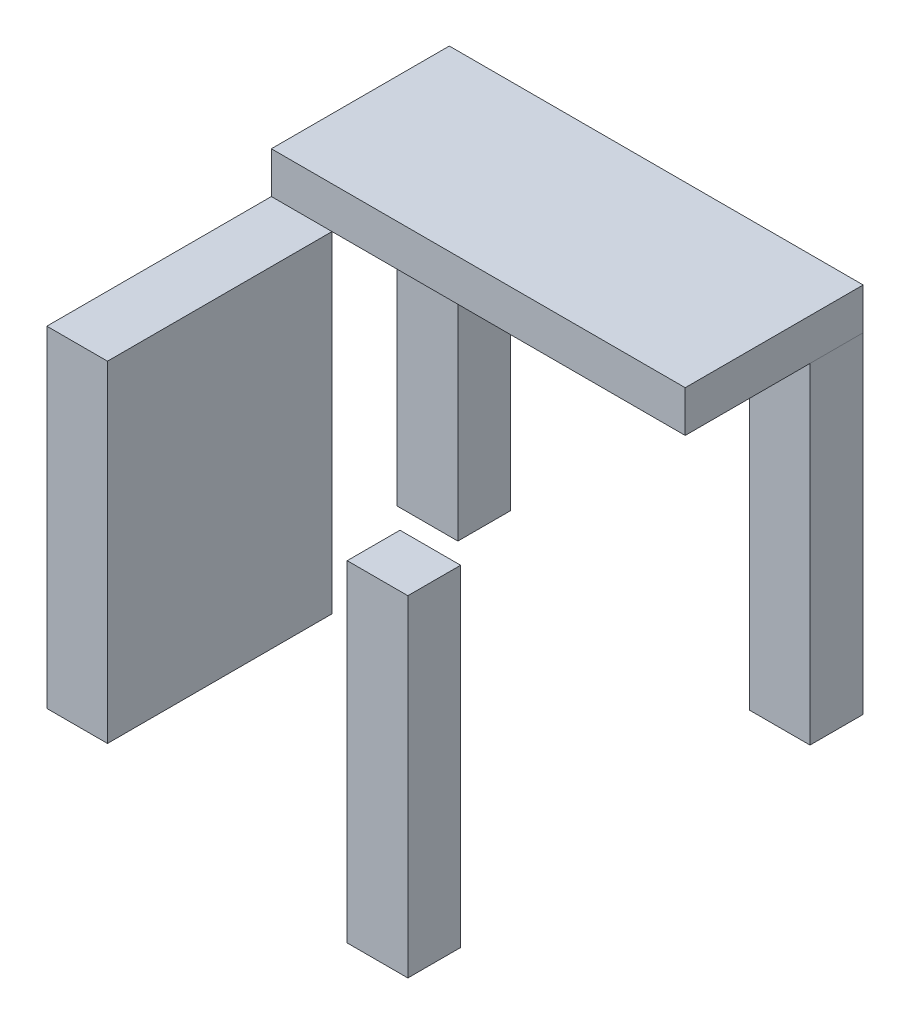
ISO-10303-21;
HEADER;
FILE_DESCRIPTION(('STEP AP214'),'2;1');
FILE_NAME('part.step','',(''),(''),'','','');
FILE_SCHEMA(('AUTOMOTIVE_DESIGN { 1 0 10303 214 1 1 1 1 }'));
ENDSEC;
DATA;
#1=APPLICATION_CONTEXT('core data for automotive mechanical design processes');
#2=APPLICATION_PROTOCOL_DEFINITION('international standard','automotive_design',2000,#1);
#3=PRODUCT_CONTEXT('',#1,'mechanical');
#4=PRODUCT('Part','Part','',(#3));
#5=PRODUCT_RELATED_PRODUCT_CATEGORY('part','',(#4));
#6=PRODUCT_DEFINITION_FORMATION('','',#4);
#7=PRODUCT_DEFINITION_CONTEXT('part definition',#1,'design');
#8=PRODUCT_DEFINITION('design','',#6,#7);
#9=PRODUCT_DEFINITION_SHAPE('','',#8);
#10=(LENGTH_UNIT() NAMED_UNIT(*) SI_UNIT(.MILLI.,.METRE.));
#11=(NAMED_UNIT(*) PLANE_ANGLE_UNIT() SI_UNIT($,.RADIAN.));
#12=(NAMED_UNIT(*) SI_UNIT($,.STERADIAN.) SOLID_ANGLE_UNIT());
#13=UNCERTAINTY_MEASURE_WITH_UNIT(LENGTH_MEASURE(1.E-05),#10,'distance_accuracy_value','');
#14=(GEOMETRIC_REPRESENTATION_CONTEXT(3) GLOBAL_UNCERTAINTY_ASSIGNED_CONTEXT((#13)) GLOBAL_UNIT_ASSIGNED_CONTEXT((#10,
#11,#12)) REPRESENTATION_CONTEXT('',''));
#15=CARTESIAN_POINT('',(0.,0.,0.));
#16=DIRECTION('',(0.,0.,1.));
#17=DIRECTION('',(1.,0.,0.));
#18=AXIS2_PLACEMENT_3D('',#15,#16,#17);
#19=CARTESIAN_POINT('',(85.36181093433,-80.,110.034688240795));
#20=DIRECTION('',(1.,0.,0.));
#21=DIRECTION('',(0.,0.,-1.));
#22=AXIS2_PLACEMENT_3D('',#19,#20,#21);
#23=PLANE('',#22);
#24=DIRECTION('',(0.,0.,-1.));
#25=VECTOR('',#24,1.);
#26=CARTESIAN_POINT('',(85.36181093433,0.,110.034688240795));
#27=LINE('',#26,#25);
#28=CARTESIAN_POINT('',(85.36181093433,0.,110.034688240795));
#29=VERTEX_POINT('',#28);
#30=CARTESIAN_POINT('',(85.36181093433,0.,97.2842820171065));
#31=VERTEX_POINT('',#30);
#32=EDGE_CURVE('E107',#29,#31,#27,.T.);
#33=ORIENTED_EDGE('',*,*,#32,.T.);
#34=DIRECTION('',(0.,1.,0.));
#35=VECTOR('',#34,1.);
#36=CARTESIAN_POINT('',(85.36181093433,-80.,97.2842820171065));
#37=LINE('',#36,#35);
#38=CARTESIAN_POINT('',(85.36181093433,-80.,97.2842820171065));
#39=VERTEX_POINT('',#38);
#40=EDGE_CURVE('E12',#39,#31,#37,.T.);
#41=ORIENTED_EDGE('',*,*,#40,.F.);
#42=DIRECTION('',(0.,0.,-1.));
#43=VECTOR('',#42,1.);
#44=CARTESIAN_POINT('',(85.36181093433,-80.,110.034688240795));
#45=LINE('',#44,#43);
#46=CARTESIAN_POINT('',(85.36181093433,-80.,110.034688240795));
#47=VERTEX_POINT('',#46);
#48=EDGE_CURVE('E95',#47,#39,#45,.T.);
#49=ORIENTED_EDGE('',*,*,#48,.F.);
#50=DIRECTION('',(0.,1.,0.));
#51=VECTOR('',#50,1.);
#52=CARTESIAN_POINT('',(85.36181093433,-80.,110.034688240795));
#53=LINE('',#52,#51);
#54=EDGE_CURVE('E103',#47,#29,#53,.T.);
#55=ORIENTED_EDGE('',*,*,#54,.T.);
#56=EDGE_LOOP('',(#33,#41,#49,#55));
#57=FACE_BOUND('',#56,.T.);
#58=ADVANCED_FACE('F44',(#57),#23,.F.);
#59=CARTESIAN_POINT('',(85.36181093433,-80.,97.2842820171065));
#60=DIRECTION('',(0.,0.,1.));
#61=DIRECTION('',(1.,0.,0.));
#62=AXIS2_PLACEMENT_3D('',#59,#60,#61);
#63=PLANE('',#62);
#64=DIRECTION('',(1.,0.,0.));
#65=VECTOR('',#64,1.);
#66=CARTESIAN_POINT('',(85.36181093433,0.,97.2842820171065));
#67=LINE('',#66,#65);
#68=CARTESIAN_POINT('',(100.019107271016,0.,97.2842820171065));
#69=VERTEX_POINT('',#68);
#70=EDGE_CURVE('E99',#31,#69,#67,.T.);
#71=ORIENTED_EDGE('',*,*,#70,.T.);
#72=DIRECTION('',(0.,1.,0.));
#73=VECTOR('',#72,1.);
#74=CARTESIAN_POINT('',(100.019107271016,-80.,97.2842820171065));
#75=LINE('',#74,#73);
#76=CARTESIAN_POINT('',(100.019107271016,-80.,97.2842820171065));
#77=VERTEX_POINT('',#76);
#78=EDGE_CURVE('E52',#77,#69,#75,.T.);
#79=ORIENTED_EDGE('',*,*,#78,.F.);
#80=DIRECTION('',(1.,0.,0.));
#81=VECTOR('',#80,1.);
#82=CARTESIAN_POINT('',(85.36181093433,-80.,97.2842820171065));
#83=LINE('',#82,#81);
#84=EDGE_CURVE('E90',#39,#77,#83,.T.);
#85=ORIENTED_EDGE('',*,*,#84,.F.);
#86=ORIENTED_EDGE('',*,*,#40,.T.);
#87=EDGE_LOOP('',(#71,#79,#85,#86));
#88=FACE_BOUND('',#87,.T.);
#89=ADVANCED_FACE('F98',(#88),#63,.F.);
#90=CARTESIAN_POINT('',(100.019107271016,-80.,110.034688240795));
#91=DIRECTION('',(-1.,0.,0.));
#92=DIRECTION('',(0.,0.,1.));
#93=AXIS2_PLACEMENT_3D('',#90,#91,#92);
#94=PLANE('',#93);
#95=DIRECTION('',(0.,0.,1.));
#96=VECTOR('',#95,1.);
#97=CARTESIAN_POINT('',(100.019107271016,0.,110.034688240795));
#98=LINE('',#97,#96);
#99=CARTESIAN_POINT('',(100.019107271016,0.,110.034688240795));
#100=VERTEX_POINT('',#99);
#101=EDGE_CURVE('E77',#69,#100,#98,.T.);
#102=ORIENTED_EDGE('',*,*,#101,.T.);
#103=DIRECTION('',(0.,1.,0.));
#104=VECTOR('',#103,1.);
#105=CARTESIAN_POINT('',(100.019107271016,-80.,110.034688240795));
#106=LINE('',#105,#104);
#107=CARTESIAN_POINT('',(100.019107271016,-80.,110.034688240795));
#108=VERTEX_POINT('',#107);
#109=EDGE_CURVE('E100',#108,#100,#106,.T.);
#110=ORIENTED_EDGE('',*,*,#109,.F.);
#111=DIRECTION('',(0.,0.,1.));
#112=VECTOR('',#111,1.);
#113=CARTESIAN_POINT('',(100.019107271016,-80.,110.034688240795));
#114=LINE('',#113,#112);
#115=EDGE_CURVE('E93',#77,#108,#114,.T.);
#116=ORIENTED_EDGE('',*,*,#115,.F.);
#117=ORIENTED_EDGE('',*,*,#78,.T.);
#118=EDGE_LOOP('',(#102,#110,#116,#117));
#119=FACE_BOUND('',#118,.T.);
#120=ADVANCED_FACE('F101',(#119),#94,.F.);
#121=CARTESIAN_POINT('',(85.36181093433,-80.,110.034688240795));
#122=DIRECTION('',(0.,0.,-1.));
#123=DIRECTION('',(-1.,0.,0.));
#124=AXIS2_PLACEMENT_3D('',#121,#122,#123);
#125=PLANE('',#124);
#126=DIRECTION('',(-1.,0.,0.));
#127=VECTOR('',#126,1.);
#128=CARTESIAN_POINT('',(85.36181093433,0.,110.034688240795));
#129=LINE('',#128,#127);
#130=EDGE_CURVE('E83',#100,#29,#129,.T.);
#131=ORIENTED_EDGE('',*,*,#130,.T.);
#132=ORIENTED_EDGE('',*,*,#54,.F.);
#133=DIRECTION('',(-1.,0.,0.));
#134=VECTOR('',#133,1.);
#135=CARTESIAN_POINT('',(85.36181093433,-80.,110.034688240795));
#136=LINE('',#135,#134);
#137=EDGE_CURVE('E60',#108,#47,#136,.T.);
#138=ORIENTED_EDGE('',*,*,#137,.F.);
#139=ORIENTED_EDGE('',*,*,#109,.T.);
#140=EDGE_LOOP('',(#131,#132,#138,#139));
#141=FACE_BOUND('',#140,.T.);
#142=ADVANCED_FACE('F114',(#141),#125,.F.);
#143=CARTESIAN_POINT('',(0.,-80.,0.));
#144=DIRECTION('',(0.,-1.,0.));
#145=DIRECTION('',(0.,0.,-1.));
#146=AXIS2_PLACEMENT_3D('',#143,#144,#145);
#147=PLANE('',#146);
#148=ORIENTED_EDGE('',*,*,#48,.T.);
#149=ORIENTED_EDGE('',*,*,#84,.T.);
#150=ORIENTED_EDGE('',*,*,#115,.T.);
#151=ORIENTED_EDGE('',*,*,#137,.T.);
#152=EDGE_LOOP('',(#148,#149,#150,#151));
#153=FACE_BOUND('',#152,.T.);
#154=ADVANCED_FACE('F91',(#153),#147,.T.);
#155=CARTESIAN_POINT('',(0.,0.,0.));
#156=DIRECTION('',(0.,-1.,0.));
#157=DIRECTION('',(0.,0.,-1.));
#158=AXIS2_PLACEMENT_3D('',#155,#156,#157);
#159=PLANE('',#158);
#160=ORIENTED_EDGE('',*,*,#32,.F.);
#161=ORIENTED_EDGE('',*,*,#130,.F.);
#162=ORIENTED_EDGE('',*,*,#101,.F.);
#163=ORIENTED_EDGE('',*,*,#70,.F.);
#164=EDGE_LOOP('',(#160,#161,#162,#163));
#165=FACE_BOUND('',#164,.T.);
#166=ADVANCED_FACE('F117',(#165),#159,.F.);
#167=CLOSED_SHELL('',(#58,#89,#120,#142,#154,#166));
#168=MANIFOLD_SOLID_BREP('B2',#167);
#169=CARTESIAN_POINT('',(0.,-80.,43.));
#170=DIRECTION('',(1.,0.,0.));
#171=DIRECTION('',(0.,0.,-1.));
#172=AXIS2_PLACEMENT_3D('',#169,#170,#171);
#173=PLANE('',#172);
#174=DIRECTION('',(0.,0.,-1.));
#175=VECTOR('',#174,1.);
#176=CARTESIAN_POINT('',(0.,0.,43.));
#177=LINE('',#176,#175);
#178=CARTESIAN_POINT('',(0.,0.,97.2495937763114));
#179=VERTEX_POINT('',#178);
#180=CARTESIAN_POINT('',(0.,0.,43.));
#181=VERTEX_POINT('',#180);
#182=EDGE_CURVE('E240',#179,#181,#177,.T.);
#183=ORIENTED_EDGE('',*,*,#182,.T.);
#184=DIRECTION('',(0.,1.,0.));
#185=VECTOR('',#184,1.);
#186=CARTESIAN_POINT('',(0.,-80.,43.));
#187=LINE('',#186,#185);
#188=CARTESIAN_POINT('',(0.,-80.,43.));
#189=VERTEX_POINT('',#188);
#190=EDGE_CURVE('E42',#189,#181,#187,.T.);
#191=ORIENTED_EDGE('',*,*,#190,.F.);
#192=DIRECTION('',(0.,0.,-1.));
#193=VECTOR('',#192,1.);
#194=CARTESIAN_POINT('',(0.,-80.,43.));
#195=LINE('',#194,#193);
#196=CARTESIAN_POINT('',(0.,-80.,97.2495937763114));
#197=VERTEX_POINT('',#196);
#198=EDGE_CURVE('E228',#197,#189,#195,.T.);
#199=ORIENTED_EDGE('',*,*,#198,.F.);
#200=DIRECTION('',(0.,1.,0.));
#201=VECTOR('',#200,1.);
#202=CARTESIAN_POINT('',(0.,-80.,97.2495937763114));
#203=LINE('',#202,#201);
#204=EDGE_CURVE('E236',#197,#179,#203,.T.);
#205=ORIENTED_EDGE('',*,*,#204,.T.);
#206=EDGE_LOOP('',(#183,#191,#199,#205));
#207=FACE_BOUND('',#206,.T.);
#208=ADVANCED_FACE('F177',(#207),#173,.F.);
#209=CARTESIAN_POINT('',(0.,-80.,43.));
#210=DIRECTION('',(0.,0.,1.));
#211=DIRECTION('',(1.,0.,0.));
#212=AXIS2_PLACEMENT_3D('',#209,#210,#211);
#213=PLANE('',#212);
#214=DIRECTION('',(1.,0.,0.));
#215=VECTOR('',#214,1.);
#216=CARTESIAN_POINT('',(0.,0.,43.));
#217=LINE('',#216,#215);
#218=CARTESIAN_POINT('',(14.6572963366857,0.,43.));
#219=VERTEX_POINT('',#218);
#220=EDGE_CURVE('E232',#181,#219,#217,.T.);
#221=ORIENTED_EDGE('',*,*,#220,.T.);
#222=DIRECTION('',(0.,1.,0.));
#223=VECTOR('',#222,1.);
#224=CARTESIAN_POINT('',(14.6572963366857,-80.,43.));
#225=LINE('',#224,#223);
#226=CARTESIAN_POINT('',(14.6572963366857,-80.,43.));
#227=VERTEX_POINT('',#226);
#228=EDGE_CURVE('E185',#227,#219,#225,.T.);
#229=ORIENTED_EDGE('',*,*,#228,.F.);
#230=DIRECTION('',(1.,0.,0.));
#231=VECTOR('',#230,1.);
#232=CARTESIAN_POINT('',(0.,-80.,43.));
#233=LINE('',#232,#231);
#234=EDGE_CURVE('E223',#189,#227,#233,.T.);
#235=ORIENTED_EDGE('',*,*,#234,.F.);
#236=ORIENTED_EDGE('',*,*,#190,.T.);
#237=EDGE_LOOP('',(#221,#229,#235,#236));
#238=FACE_BOUND('',#237,.T.);
#239=ADVANCED_FACE('F231',(#238),#213,.F.);
#240=CARTESIAN_POINT('',(14.6572963366857,-80.,43.));
#241=DIRECTION('',(-1.,0.,0.));
#242=DIRECTION('',(0.,0.,1.));
#243=AXIS2_PLACEMENT_3D('',#240,#241,#242);
#244=PLANE('',#243);
#245=DIRECTION('',(0.,0.,1.));
#246=VECTOR('',#245,1.);
#247=CARTESIAN_POINT('',(14.6572963366857,0.,43.));
#248=LINE('',#247,#246);
#249=CARTESIAN_POINT('',(14.6572963366857,0.,97.2495937763114));
#250=VERTEX_POINT('',#249);
#251=EDGE_CURVE('E210',#219,#250,#248,.T.);
#252=ORIENTED_EDGE('',*,*,#251,.T.);
#253=DIRECTION('',(0.,1.,0.));
#254=VECTOR('',#253,1.);
#255=CARTESIAN_POINT('',(14.6572963366857,-80.,97.2495937763114));
#256=LINE('',#255,#254);
#257=CARTESIAN_POINT('',(14.6572963366857,-80.,97.2495937763114));
#258=VERTEX_POINT('',#257);
#259=EDGE_CURVE('E233',#258,#250,#256,.T.);
#260=ORIENTED_EDGE('',*,*,#259,.F.);
#261=DIRECTION('',(0.,0.,1.));
#262=VECTOR('',#261,1.);
#263=CARTESIAN_POINT('',(14.6572963366857,-80.,43.));
#264=LINE('',#263,#262);
#265=EDGE_CURVE('E226',#227,#258,#264,.T.);
#266=ORIENTED_EDGE('',*,*,#265,.F.);
#267=ORIENTED_EDGE('',*,*,#228,.T.);
#268=EDGE_LOOP('',(#252,#260,#266,#267));
#269=FACE_BOUND('',#268,.T.);
#270=ADVANCED_FACE('F234',(#269),#244,.F.);
#271=CARTESIAN_POINT('',(0.,-80.,97.2495937763114));
#272=DIRECTION('',(0.,0.,-1.));
#273=DIRECTION('',(-1.,0.,0.));
#274=AXIS2_PLACEMENT_3D('',#271,#272,#273);
#275=PLANE('',#274);
#276=DIRECTION('',(-1.,0.,0.));
#277=VECTOR('',#276,1.);
#278=CARTESIAN_POINT('',(0.,0.,97.2495937763114));
#279=LINE('',#278,#277);
#280=EDGE_CURVE('E216',#250,#179,#279,.T.);
#281=ORIENTED_EDGE('',*,*,#280,.T.);
#282=ORIENTED_EDGE('',*,*,#204,.F.);
#283=DIRECTION('',(-1.,0.,0.));
#284=VECTOR('',#283,1.);
#285=CARTESIAN_POINT('',(0.,-80.,97.2495937763114));
#286=LINE('',#285,#284);
#287=EDGE_CURVE('E193',#258,#197,#286,.T.);
#288=ORIENTED_EDGE('',*,*,#287,.F.);
#289=ORIENTED_EDGE('',*,*,#259,.T.);
#290=EDGE_LOOP('',(#281,#282,#288,#289));
#291=FACE_BOUND('',#290,.T.);
#292=ADVANCED_FACE('F247',(#291),#275,.F.);
#293=CARTESIAN_POINT('',(0.,-80.,0.));
#294=DIRECTION('',(0.,1.,0.));
#295=DIRECTION('',(0.,0.,1.));
#296=AXIS2_PLACEMENT_3D('',#293,#294,#295);
#297=PLANE('',#296);
#298=ORIENTED_EDGE('',*,*,#198,.T.);
#299=ORIENTED_EDGE('',*,*,#234,.T.);
#300=ORIENTED_EDGE('',*,*,#265,.T.);
#301=ORIENTED_EDGE('',*,*,#287,.T.);
#302=EDGE_LOOP('',(#298,#299,#300,#301));
#303=FACE_BOUND('',#302,.T.);
#304=ADVANCED_FACE('F224',(#303),#297,.F.);
#305=CARTESIAN_POINT('',(0.,0.,0.));
#306=DIRECTION('',(0.,1.,0.));
#307=DIRECTION('',(0.,0.,1.));
#308=AXIS2_PLACEMENT_3D('',#305,#306,#307);
#309=PLANE('',#308);
#310=ORIENTED_EDGE('',*,*,#182,.F.);
#311=ORIENTED_EDGE('',*,*,#280,.F.);
#312=ORIENTED_EDGE('',*,*,#251,.F.);
#313=ORIENTED_EDGE('',*,*,#220,.F.);
#314=EDGE_LOOP('',(#310,#311,#312,#313));
#315=FACE_BOUND('',#314,.T.);
#316=ADVANCED_FACE('F250',(#315),#309,.T.);
#317=CLOSED_SHELL('',(#208,#239,#270,#292,#304,#316));
#318=MANIFOLD_SOLID_BREP('B6',#317);
#319=CARTESIAN_POINT('',(0.,0.,43.));
#320=DIRECTION('',(0.,1.,0.));
#321=DIRECTION('',(0.,0.,1.));
#322=AXIS2_PLACEMENT_3D('',#319,#320,#321);
#323=PLANE('',#322);
#324=DIRECTION('',(0.,0.,-1.));
#325=VECTOR('',#324,1.);
#326=CARTESIAN_POINT('',(85.2148558255428,0.,12.7157179828936));
#327=LINE('',#326,#325);
#328=CARTESIAN_POINT('',(85.2148558255428,0.,12.7157179828936));
#329=VERTEX_POINT('',#328);
#330=CARTESIAN_POINT('',(85.2148558255428,0.,0.));
#331=VERTEX_POINT('',#330);
#332=EDGE_CURVE('E318',#329,#331,#327,.T.);
#333=ORIENTED_EDGE('',*,*,#332,.F.);
#334=DIRECTION('',(-1.,0.,0.));
#335=VECTOR('',#334,1.);
#336=CARTESIAN_POINT('',(85.2148558255428,0.,12.7157179828936));
#337=LINE('',#336,#335);
#338=CARTESIAN_POINT('',(99.8721521622285,0.,12.7157179828936));
#339=VERTEX_POINT('',#338);
#340=EDGE_CURVE('E322',#339,#329,#337,.T.);
#341=ORIENTED_EDGE('',*,*,#340,.F.);
#342=DIRECTION('',(0.,0.,1.));
#343=VECTOR('',#342,1.);
#344=CARTESIAN_POINT('',(99.8721521622285,0.,12.7157179828936));
#345=LINE('',#344,#343);
#346=CARTESIAN_POINT('',(99.8721521622285,0.,0.));
#347=VERTEX_POINT('',#346);
#348=EDGE_CURVE('E647',#347,#339,#345,.T.);
#349=ORIENTED_EDGE('',*,*,#348,.F.);
#350=DIRECTION('',(1.,0.,0.));
#351=VECTOR('',#350,1.);
#352=CARTESIAN_POINT('',(0.,0.,0.));
#353=LINE('',#352,#351);
#354=CARTESIAN_POINT('',(100.,0.,0.));
#355=VERTEX_POINT('',#354);
#356=EDGE_CURVE('E478',#347,#355,#353,.T.);
#357=ORIENTED_EDGE('',*,*,#356,.T.);
#358=DIRECTION('',(0.,0.,-1.));
#359=VECTOR('',#358,1.);
#360=CARTESIAN_POINT('',(100.,0.,43.));
#361=LINE('',#360,#359);
#362=CARTESIAN_POINT('',(100.,0.,43.));
#363=VERTEX_POINT('',#362);
#364=EDGE_CURVE('E490',#363,#355,#361,.T.);
#365=ORIENTED_EDGE('',*,*,#364,.F.);
#366=DIRECTION('',(1.,0.,0.));
#367=VECTOR('',#366,1.);
#368=CARTESIAN_POINT('',(0.,0.,43.));
#369=LINE('',#368,#367);
#370=CARTESIAN_POINT('',(0.,0.,43.));
#371=VERTEX_POINT('',#370);
#372=EDGE_CURVE('E468',#371,#363,#369,.T.);
#373=ORIENTED_EDGE('',*,*,#372,.F.);
#374=DIRECTION('',(0.,0.,-1.));
#375=VECTOR('',#374,1.);
#376=CARTESIAN_POINT('',(0.,0.,43.));
#377=LINE('',#376,#375);
#378=CARTESIAN_POINT('',(0.,0.,12.5687628741064));
#379=VERTEX_POINT('',#378);
#380=EDGE_CURVE('E305',#371,#379,#377,.T.);
#381=ORIENTED_EDGE('',*,*,#380,.T.);
#382=DIRECTION('',(-1.,0.,0.));
#383=VECTOR('',#382,1.);
#384=CARTESIAN_POINT('',(-0.0191072710157194,0.,12.5687628741064));
#385=LINE('',#384,#383);
#386=CARTESIAN_POINT('',(14.63818906567,0.,12.5687628741064));
#387=VERTEX_POINT('',#386);
#388=EDGE_CURVE('E441',#387,#379,#385,.T.);
#389=ORIENTED_EDGE('',*,*,#388,.F.);
#390=DIRECTION('',(0.,0.,1.));
#391=VECTOR('',#390,1.);
#392=CARTESIAN_POINT('',(14.63818906567,0.,12.5687628741064));
#393=LINE('',#392,#391);
#394=CARTESIAN_POINT('',(14.63818906567,0.,0.));
#395=VERTEX_POINT('',#394);
#396=EDGE_CURVE('E175',#395,#387,#393,.T.);
#397=ORIENTED_EDGE('',*,*,#396,.F.);
#398=EDGE_CURVE('E483',#395,#331,#353,.T.);
#399=ORIENTED_EDGE('',*,*,#398,.T.);
#400=EDGE_LOOP('',(#333,#341,#349,#357,#365,#373,#381,#389,#397,#399));
#401=FACE_BOUND('',#400,.T.);
#402=ADVANCED_FACE('F301',(#401),#323,.F.);
#403=CARTESIAN_POINT('',(0.,0.,43.));
#404=DIRECTION('',(1.,0.,0.));
#405=DIRECTION('',(0.,0.,-1.));
#406=AXIS2_PLACEMENT_3D('',#403,#404,#405);
#407=PLANE('',#406);
#408=DIRECTION('',(0.,-1.,0.));
#409=VECTOR('',#408,1.);
#410=CARTESIAN_POINT('',(0.,0.,0.));
#411=LINE('',#410,#409);
#412=CARTESIAN_POINT('',(0.,10.,0.));
#413=VERTEX_POINT('',#412);
#414=CARTESIAN_POINT('',(0.,0.,0.));
#415=VERTEX_POINT('',#414);
#416=EDGE_CURVE('E464',#413,#415,#411,.T.);
#417=ORIENTED_EDGE('',*,*,#416,.T.);
#418=EDGE_CURVE('E492',#379,#415,#377,.T.);
#419=ORIENTED_EDGE('',*,*,#418,.F.);
#420=ORIENTED_EDGE('',*,*,#380,.F.);
#421=DIRECTION('',(0.,-1.,0.));
#422=VECTOR('',#421,1.);
#423=CARTESIAN_POINT('',(0.,0.,43.));
#424=LINE('',#423,#422);
#425=CARTESIAN_POINT('',(0.,10.,43.));
#426=VERTEX_POINT('',#425);
#427=EDGE_CURVE('E465',#426,#371,#424,.T.);
#428=ORIENTED_EDGE('',*,*,#427,.F.);
#429=DIRECTION('',(0.,0.,-1.));
#430=VECTOR('',#429,1.);
#431=CARTESIAN_POINT('',(0.,10.,43.));
#432=LINE('',#431,#430);
#433=EDGE_CURVE('E475',#426,#413,#432,.T.);
#434=ORIENTED_EDGE('',*,*,#433,.T.);
#435=EDGE_LOOP('',(#417,#419,#420,#428,#434));
#436=FACE_BOUND('',#435,.T.);
#437=ADVANCED_FACE('F303',(#436),#407,.F.);
#438=CARTESIAN_POINT('',(100.,0.,43.));
#439=DIRECTION('',(-1.,0.,0.));
#440=DIRECTION('',(0.,0.,1.));
#441=AXIS2_PLACEMENT_3D('',#438,#439,#440);
#442=PLANE('',#441);
#443=DIRECTION('',(0.,1.,0.));
#444=VECTOR('',#443,1.);
#445=CARTESIAN_POINT('',(100.,0.,0.));
#446=LINE('',#445,#444);
#447=CARTESIAN_POINT('',(100.,10.,0.));
#448=VERTEX_POINT('',#447);
#449=EDGE_CURVE('E482',#355,#448,#446,.T.);
#450=ORIENTED_EDGE('',*,*,#449,.T.);
#451=DIRECTION('',(0.,0.,-1.));
#452=VECTOR('',#451,1.);
#453=CARTESIAN_POINT('',(100.,10.,43.));
#454=LINE('',#453,#452);
#455=CARTESIAN_POINT('',(100.,10.,43.));
#456=VERTEX_POINT('',#455);
#457=EDGE_CURVE('E488',#456,#448,#454,.T.);
#458=ORIENTED_EDGE('',*,*,#457,.F.);
#459=DIRECTION('',(0.,1.,0.));
#460=VECTOR('',#459,1.);
#461=CARTESIAN_POINT('',(100.,0.,43.));
#462=LINE('',#461,#460);
#463=EDGE_CURVE('E471',#363,#456,#462,.T.);
#464=ORIENTED_EDGE('',*,*,#463,.F.);
#465=ORIENTED_EDGE('',*,*,#364,.T.);
#466=EDGE_LOOP('',(#450,#458,#464,#465));
#467=FACE_BOUND('',#466,.T.);
#468=ADVANCED_FACE('F543',(#467),#442,.F.);
#469=CARTESIAN_POINT('',(0.,10.,43.));
#470=DIRECTION('',(0.,-1.,0.));
#471=DIRECTION('',(0.,0.,-1.));
#472=AXIS2_PLACEMENT_3D('',#469,#470,#471);
#473=PLANE('',#472);
#474=DIRECTION('',(-1.,0.,0.));
#475=VECTOR('',#474,1.);
#476=CARTESIAN_POINT('',(0.,10.,0.));
#477=LINE('',#476,#475);
#478=EDGE_CURVE('E469',#448,#413,#477,.T.);
#479=ORIENTED_EDGE('',*,*,#478,.T.);
#480=ORIENTED_EDGE('',*,*,#433,.F.);
#481=DIRECTION('',(-1.,0.,0.));
#482=VECTOR('',#481,1.);
#483=CARTESIAN_POINT('',(0.,10.,43.));
#484=LINE('',#483,#482);
#485=EDGE_CURVE('E473',#456,#426,#484,.T.);
#486=ORIENTED_EDGE('',*,*,#485,.F.);
#487=ORIENTED_EDGE('',*,*,#457,.T.);
#488=EDGE_LOOP('',(#479,#480,#486,#487));
#489=FACE_BOUND('',#488,.T.);
#490=ADVANCED_FACE('F547',(#489),#473,.F.);
#491=CARTESIAN_POINT('',(0.,0.,43.));
#492=DIRECTION('',(0.,0.,-1.));
#493=DIRECTION('',(-1.,0.,0.));
#494=AXIS2_PLACEMENT_3D('',#491,#492,#493);
#495=PLANE('',#494);
#496=ORIENTED_EDGE('',*,*,#427,.T.);
#497=ORIENTED_EDGE('',*,*,#372,.T.);
#498=ORIENTED_EDGE('',*,*,#463,.T.);
#499=ORIENTED_EDGE('',*,*,#485,.T.);
#500=EDGE_LOOP('',(#496,#497,#498,#499));
#501=FACE_BOUND('',#500,.T.);
#502=ADVANCED_FACE('F550',(#501),#495,.F.);
#503=CARTESIAN_POINT('',(0.,0.,0.));
#504=DIRECTION('',(0.,0.,-1.));
#505=DIRECTION('',(-1.,0.,0.));
#506=AXIS2_PLACEMENT_3D('',#503,#504,#505);
#507=PLANE('',#506);
#508=ORIENTED_EDGE('',*,*,#416,.F.);
#509=ORIENTED_EDGE('',*,*,#478,.F.);
#510=ORIENTED_EDGE('',*,*,#449,.F.);
#511=ORIENTED_EDGE('',*,*,#356,.F.);
#512=EDGE_CURVE('E520',#331,#347,#353,.T.);
#513=ORIENTED_EDGE('',*,*,#512,.F.);
#514=ORIENTED_EDGE('',*,*,#398,.F.);
#515=EDGE_CURVE('E479',#415,#395,#353,.T.);
#516=ORIENTED_EDGE('',*,*,#515,.F.);
#517=EDGE_LOOP('',(#508,#509,#510,#511,#513,#514,#516));
#518=FACE_BOUND('',#517,.T.);
#519=ADVANCED_FACE('F518',(#518),#507,.T.);
#520=CARTESIAN_POINT('',(0.,0.,0.));
#521=DIRECTION('',(0.,-1.,0.));
#522=DIRECTION('',(0.,0.,-1.));
#523=AXIS2_PLACEMENT_3D('',#520,#521,#522);
#524=PLANE('',#523);
#525=ORIENTED_EDGE('',*,*,#418,.T.);
#526=ORIENTED_EDGE('',*,*,#515,.T.);
#527=CARTESIAN_POINT('',(14.63818906567,0.,-0.181643349582247));
#528=VERTEX_POINT('',#527);
#529=EDGE_CURVE('E311',#528,#395,#393,.T.);
#530=ORIENTED_EDGE('',*,*,#529,.F.);
#531=DIRECTION('',(1.,0.,0.));
#532=VECTOR('',#531,1.);
#533=CARTESIAN_POINT('',(-0.0191072710157177,0.,-0.181643349582247));
#534=LINE('',#533,#532);
#535=CARTESIAN_POINT('',(-0.0191072710157177,0.,-0.181643349582247));
#536=VERTEX_POINT('',#535);
#537=EDGE_CURVE('E431',#536,#528,#534,.T.);
#538=ORIENTED_EDGE('',*,*,#537,.F.);
#539=DIRECTION('',(0.,0.,-1.));
#540=VECTOR('',#539,1.);
#541=CARTESIAN_POINT('',(-0.0191072710157194,0.,12.5687628741064));
#542=LINE('',#541,#540);
#543=CARTESIAN_POINT('',(-0.0191072710157194,0.,12.5687628741064));
#544=VERTEX_POINT('',#543);
#545=EDGE_CURVE('E428',#544,#536,#542,.T.);
#546=ORIENTED_EDGE('',*,*,#545,.F.);
#547=EDGE_CURVE('E450',#379,#544,#385,.T.);
#548=ORIENTED_EDGE('',*,*,#547,.F.);
#549=EDGE_LOOP('',(#525,#526,#530,#538,#546,#548));
#550=FACE_BOUND('',#549,.T.);
#551=ADVANCED_FACE('F505',(#550),#524,.F.);
#552=CARTESIAN_POINT('',(-0.0191072710157194,-80.,12.5687628741064));
#553=DIRECTION('',(1.,0.,0.));
#554=DIRECTION('',(0.,0.,-1.));
#555=AXIS2_PLACEMENT_3D('',#552,#553,#554);
#556=PLANE('',#555);
#557=ORIENTED_EDGE('',*,*,#545,.T.);
#558=DIRECTION('',(0.,1.,0.));
#559=VECTOR('',#558,1.);
#560=CARTESIAN_POINT('',(-0.0191072710157177,-80.,-0.181643349582247));
#561=LINE('',#560,#559);
#562=CARTESIAN_POINT('',(-0.0191072710157177,-80.,-0.181643349582247));
#563=VERTEX_POINT('',#562);
#564=EDGE_CURVE('E461',#563,#536,#561,.T.);
#565=ORIENTED_EDGE('',*,*,#564,.F.);
#566=DIRECTION('',(0.,0.,-1.));
#567=VECTOR('',#566,1.);
#568=CARTESIAN_POINT('',(-0.0191072710157194,-80.,12.5687628741064));
#569=LINE('',#568,#567);
#570=CARTESIAN_POINT('',(-0.0191072710157194,-80.,12.5687628741064));
#571=VERTEX_POINT('',#570);
#572=EDGE_CURVE('E437',#571,#563,#569,.T.);
#573=ORIENTED_EDGE('',*,*,#572,.F.);
#574=DIRECTION('',(0.,1.,0.));
#575=VECTOR('',#574,1.);
#576=CARTESIAN_POINT('',(-0.0191072710157194,-80.,12.5687628741064));
#577=LINE('',#576,#575);
#578=EDGE_CURVE('E446',#571,#544,#577,.T.);
#579=ORIENTED_EDGE('',*,*,#578,.T.);
#580=EDGE_LOOP('',(#557,#565,#573,#579));
#581=FACE_BOUND('',#580,.T.);
#582=ADVANCED_FACE('F527',(#581),#556,.F.);
#583=CARTESIAN_POINT('',(-0.0191072710157177,-80.,-0.181643349582247));
#584=DIRECTION('',(0.,0.,1.));
#585=DIRECTION('',(1.,0.,0.));
#586=AXIS2_PLACEMENT_3D('',#583,#584,#585);
#587=PLANE('',#586);
#588=ORIENTED_EDGE('',*,*,#537,.T.);
#589=DIRECTION('',(0.,1.,0.));
#590=VECTOR('',#589,1.);
#591=CARTESIAN_POINT('',(14.63818906567,-80.,-0.181643349582247));
#592=LINE('',#591,#590);
#593=CARTESIAN_POINT('',(14.63818906567,-80.,-0.181643349582247));
#594=VERTEX_POINT('',#593);
#595=EDGE_CURVE('E458',#594,#528,#592,.T.);
#596=ORIENTED_EDGE('',*,*,#595,.F.);
#597=DIRECTION('',(1.,0.,0.));
#598=VECTOR('',#597,1.);
#599=CARTESIAN_POINT('',(-0.0191072710157177,-80.,-0.181643349582247));
#600=LINE('',#599,#598);
#601=EDGE_CURVE('E440',#563,#594,#600,.T.);
#602=ORIENTED_EDGE('',*,*,#601,.F.);
#603=ORIENTED_EDGE('',*,*,#564,.T.);
#604=EDGE_LOOP('',(#588,#596,#602,#603));
#605=FACE_BOUND('',#604,.T.);
#606=ADVANCED_FACE('F524',(#605),#587,.F.);
#607=CARTESIAN_POINT('',(14.63818906567,-80.,12.5687628741064));
#608=DIRECTION('',(-1.,0.,0.));
#609=DIRECTION('',(0.,0.,1.));
#610=AXIS2_PLACEMENT_3D('',#607,#608,#609);
#611=PLANE('',#610);
#612=ORIENTED_EDGE('',*,*,#529,.T.);
#613=ORIENTED_EDGE('',*,*,#396,.T.);
#614=DIRECTION('',(0.,1.,0.));
#615=VECTOR('',#614,1.);
#616=CARTESIAN_POINT('',(14.63818906567,-80.,12.5687628741064));
#617=LINE('',#616,#615);
#618=CARTESIAN_POINT('',(14.63818906567,-80.,12.5687628741064));
#619=VERTEX_POINT('',#618);
#620=EDGE_CURVE('E455',#619,#387,#617,.T.);
#621=ORIENTED_EDGE('',*,*,#620,.F.);
#622=DIRECTION('',(0.,0.,1.));
#623=VECTOR('',#622,1.);
#624=CARTESIAN_POINT('',(14.63818906567,-80.,12.5687628741064));
#625=LINE('',#624,#623);
#626=EDGE_CURVE('E443',#594,#619,#625,.T.);
#627=ORIENTED_EDGE('',*,*,#626,.F.);
#628=ORIENTED_EDGE('',*,*,#595,.T.);
#629=EDGE_LOOP('',(#612,#613,#621,#627,#628));
#630=FACE_BOUND('',#629,.T.);
#631=ADVANCED_FACE('F513',(#630),#611,.F.);
#632=CARTESIAN_POINT('',(-0.0191072710157194,-80.,12.5687628741064));
#633=DIRECTION('',(0.,0.,-1.));
#634=DIRECTION('',(-1.,0.,0.));
#635=AXIS2_PLACEMENT_3D('',#632,#633,#634);
#636=PLANE('',#635);
#637=ORIENTED_EDGE('',*,*,#388,.T.);
#638=ORIENTED_EDGE('',*,*,#547,.T.);
#639=ORIENTED_EDGE('',*,*,#578,.F.);
#640=DIRECTION('',(-1.,0.,0.));
#641=VECTOR('',#640,1.);
#642=CARTESIAN_POINT('',(-0.0191072710157194,-80.,12.5687628741064));
#643=LINE('',#642,#641);
#644=EDGE_CURVE('E445',#619,#571,#643,.T.);
#645=ORIENTED_EDGE('',*,*,#644,.F.);
#646=ORIENTED_EDGE('',*,*,#620,.T.);
#647=EDGE_LOOP('',(#637,#638,#639,#645,#646));
#648=FACE_BOUND('',#647,.T.);
#649=ADVANCED_FACE('F508',(#648),#636,.F.);
#650=CARTESIAN_POINT('',(0.,-80.,0.));
#651=DIRECTION('',(0.,-1.,0.));
#652=DIRECTION('',(0.,0.,-1.));
#653=AXIS2_PLACEMENT_3D('',#650,#651,#652);
#654=PLANE('',#653);
#655=ORIENTED_EDGE('',*,*,#572,.T.);
#656=ORIENTED_EDGE('',*,*,#601,.T.);
#657=ORIENTED_EDGE('',*,*,#626,.T.);
#658=ORIENTED_EDGE('',*,*,#644,.T.);
#659=EDGE_LOOP('',(#655,#656,#657,#658));
#660=FACE_BOUND('',#659,.T.);
#661=ADVANCED_FACE('F529',(#660),#654,.T.);
#662=CARTESIAN_POINT('',(85.2148558255428,-80.,12.7157179828936));
#663=DIRECTION('',(1.,0.,0.));
#664=DIRECTION('',(0.,0.,-1.));
#665=AXIS2_PLACEMENT_3D('',#662,#663,#664);
#666=PLANE('',#665);
#667=ORIENTED_EDGE('',*,*,#332,.T.);
#668=CARTESIAN_POINT('',(85.2148558255428,0.,-0.0346882407950694));
#669=VERTEX_POINT('',#668);
#670=EDGE_CURVE('E426',#331,#669,#327,.T.);
#671=ORIENTED_EDGE('',*,*,#670,.T.);
#672=DIRECTION('',(0.,1.,0.));
#673=VECTOR('',#672,1.);
#674=CARTESIAN_POINT('',(85.2148558255428,-80.,-0.0346882407950694));
#675=LINE('',#674,#673);
#676=CARTESIAN_POINT('',(85.2148558255428,-80.,-0.0346882407950694));
#677=VERTEX_POINT('',#676);
#678=EDGE_CURVE('E408',#677,#669,#675,.T.);
#679=ORIENTED_EDGE('',*,*,#678,.F.);
#680=DIRECTION('',(0.,0.,-1.));
#681=VECTOR('',#680,1.);
#682=CARTESIAN_POINT('',(85.2148558255428,-80.,12.7157179828936));
#683=LINE('',#682,#681);
#684=CARTESIAN_POINT('',(85.2148558255428,-80.,12.7157179828936));
#685=VERTEX_POINT('',#684);
#686=EDGE_CURVE('E414',#685,#677,#683,.T.);
#687=ORIENTED_EDGE('',*,*,#686,.F.);
#688=DIRECTION('',(0.,1.,0.));
#689=VECTOR('',#688,1.);
#690=CARTESIAN_POINT('',(85.2148558255428,-80.,12.7157179828936));
#691=LINE('',#690,#689);
#692=EDGE_CURVE('E655',#685,#329,#691,.T.);
#693=ORIENTED_EDGE('',*,*,#692,.T.);
#694=EDGE_LOOP('',(#667,#671,#679,#687,#693));
#695=FACE_BOUND('',#694,.T.);
#696=ADVANCED_FACE('F424',(#695),#666,.F.);
#697=CARTESIAN_POINT('',(85.2148558255428,-80.,-0.0346882407950694));
#698=DIRECTION('',(0.,0.,1.));
#699=DIRECTION('',(1.,0.,0.));
#700=AXIS2_PLACEMENT_3D('',#697,#698,#699);
#701=PLANE('',#700);
#702=DIRECTION('',(1.,0.,0.));
#703=VECTOR('',#702,1.);
#704=CARTESIAN_POINT('',(85.2148558255428,0.,-0.0346882407950694));
#705=LINE('',#704,#703);
#706=CARTESIAN_POINT('',(99.8721521622285,0.,-0.0346882407950694));
#707=VERTEX_POINT('',#706);
#708=EDGE_CURVE('E651',#669,#707,#705,.T.);
#709=ORIENTED_EDGE('',*,*,#708,.T.);
#710=DIRECTION('',(0.,1.,0.));
#711=VECTOR('',#710,1.);
#712=CARTESIAN_POINT('',(99.8721521622285,-80.,-0.0346882407950694));
#713=LINE('',#712,#711);
#714=CARTESIAN_POINT('',(99.8721521622285,-80.,-0.0346882407950694));
#715=VERTEX_POINT('',#714);
#716=EDGE_CURVE('E410',#715,#707,#713,.T.);
#717=ORIENTED_EDGE('',*,*,#716,.F.);
#718=DIRECTION('',(1.,0.,0.));
#719=VECTOR('',#718,1.);
#720=CARTESIAN_POINT('',(85.2148558255428,-80.,-0.0346882407950694));
#721=LINE('',#720,#719);
#722=EDGE_CURVE('E404',#677,#715,#721,.T.);
#723=ORIENTED_EDGE('',*,*,#722,.F.);
#724=ORIENTED_EDGE('',*,*,#678,.T.);
#725=EDGE_LOOP('',(#709,#717,#723,#724));
#726=FACE_BOUND('',#725,.T.);
#727=ADVANCED_FACE('F406',(#726),#701,.F.);
#728=CARTESIAN_POINT('',(99.8721521622285,-80.,12.7157179828936));
#729=DIRECTION('',(-1.,0.,0.));
#730=DIRECTION('',(0.,0.,1.));
#731=AXIS2_PLACEMENT_3D('',#728,#729,#730);
#732=PLANE('',#731);
#733=EDGE_CURVE('E645',#707,#347,#345,.T.);
#734=ORIENTED_EDGE('',*,*,#733,.T.);
#735=ORIENTED_EDGE('',*,*,#348,.T.);
#736=DIRECTION('',(0.,1.,0.));
#737=VECTOR('',#736,1.);
#738=CARTESIAN_POINT('',(99.8721521622285,-80.,12.7157179828936));
#739=LINE('',#738,#737);
#740=CARTESIAN_POINT('',(99.8721521622285,-80.,12.7157179828936));
#741=VERTEX_POINT('',#740);
#742=EDGE_CURVE('E433',#741,#339,#739,.T.);
#743=ORIENTED_EDGE('',*,*,#742,.F.);
#744=DIRECTION('',(0.,0.,1.));
#745=VECTOR('',#744,1.);
#746=CARTESIAN_POINT('',(99.8721521622285,-80.,12.7157179828936));
#747=LINE('',#746,#745);
#748=EDGE_CURVE('E413',#715,#741,#747,.T.);
#749=ORIENTED_EDGE('',*,*,#748,.F.);
#750=ORIENTED_EDGE('',*,*,#716,.T.);
#751=EDGE_LOOP('',(#734,#735,#743,#749,#750));
#752=FACE_BOUND('',#751,.T.);
#753=ADVANCED_FACE('F602',(#752),#732,.F.);
#754=CARTESIAN_POINT('',(85.2148558255428,-80.,12.7157179828936));
#755=DIRECTION('',(0.,0.,-1.));
#756=DIRECTION('',(-1.,0.,0.));
#757=AXIS2_PLACEMENT_3D('',#754,#755,#756);
#758=PLANE('',#757);
#759=ORIENTED_EDGE('',*,*,#340,.T.);
#760=ORIENTED_EDGE('',*,*,#692,.F.);
#761=DIRECTION('',(-1.,0.,0.));
#762=VECTOR('',#761,1.);
#763=CARTESIAN_POINT('',(85.2148558255428,-80.,12.7157179828936));
#764=LINE('',#763,#762);
#765=EDGE_CURVE('E419',#741,#685,#764,.T.);
#766=ORIENTED_EDGE('',*,*,#765,.F.);
#767=ORIENTED_EDGE('',*,*,#742,.T.);
#768=EDGE_LOOP('',(#759,#760,#766,#767));
#769=FACE_BOUND('',#768,.T.);
#770=ADVANCED_FACE('F611',(#769),#758,.F.);
#771=CARTESIAN_POINT('',(0.,-80.,0.));
#772=DIRECTION('',(0.,-1.,0.));
#773=DIRECTION('',(0.,0.,-1.));
#774=AXIS2_PLACEMENT_3D('',#771,#772,#773);
#775=PLANE('',#774);
#776=ORIENTED_EDGE('',*,*,#686,.T.);
#777=ORIENTED_EDGE('',*,*,#722,.T.);
#778=ORIENTED_EDGE('',*,*,#748,.T.);
#779=ORIENTED_EDGE('',*,*,#765,.T.);
#780=EDGE_LOOP('',(#776,#777,#778,#779));
#781=FACE_BOUND('',#780,.T.);
#782=ADVANCED_FACE('F417',(#781),#775,.T.);
#783=CARTESIAN_POINT('',(0.,0.,0.));
#784=DIRECTION('',(0.,-1.,0.));
#785=DIRECTION('',(0.,0.,-1.));
#786=AXIS2_PLACEMENT_3D('',#783,#784,#785);
#787=PLANE('',#786);
#788=ORIENTED_EDGE('',*,*,#512,.T.);
#789=ORIENTED_EDGE('',*,*,#733,.F.);
#790=ORIENTED_EDGE('',*,*,#708,.F.);
#791=ORIENTED_EDGE('',*,*,#670,.F.);
#792=EDGE_LOOP('',(#788,#789,#790,#791));
#793=FACE_BOUND('',#792,.T.);
#794=ADVANCED_FACE('F630',(#793),#787,.F.);
#795=CLOSED_SHELL('',(#402,#437,#468,#490,#502,#519,#551,#582,#606,#631,#649,#661,#696,#727,
#753,#770,#782,#794));
#796=MANIFOLD_SOLID_BREP('B36',#795);
#797=ADVANCED_BREP_SHAPE_REPRESENTATION('',(#18,#168,#318,#796),#14);
#798=SHAPE_DEFINITION_REPRESENTATION(#9,#797);
ENDSEC;
END-ISO-10303-21;
